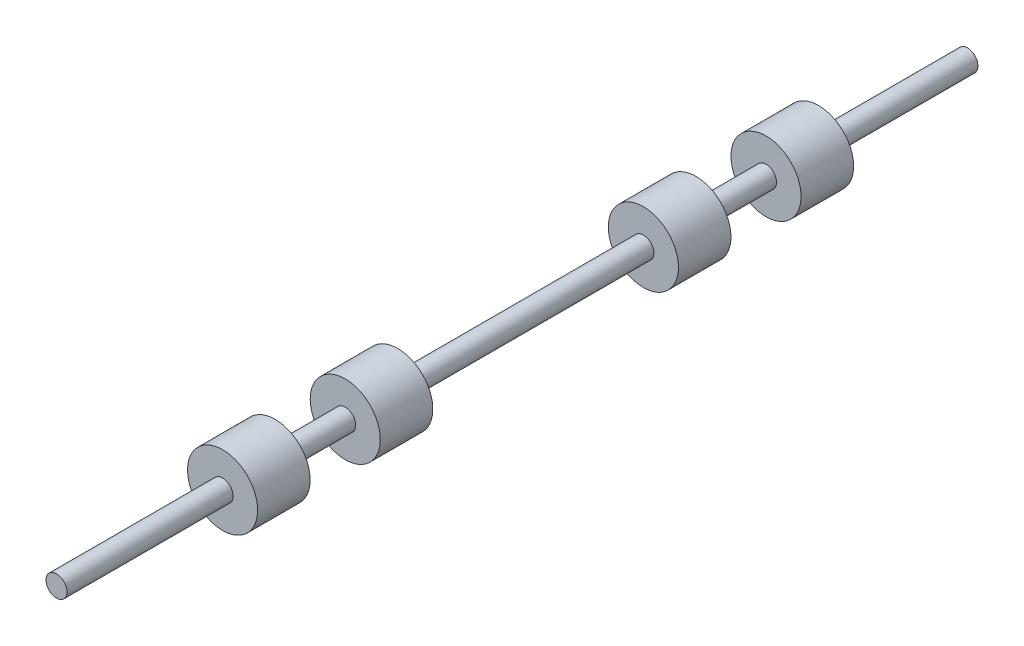
ISO-10303-21;
HEADER;
FILE_DESCRIPTION(('STEP AP214'),'2;1');
FILE_NAME('part.step','',(''),(''),'','','');
FILE_SCHEMA(('AUTOMOTIVE_DESIGN { 1 0 10303 214 1 1 1 1 }'));
ENDSEC;
DATA;
#1=APPLICATION_CONTEXT('core data for automotive mechanical design processes');
#2=APPLICATION_PROTOCOL_DEFINITION('international standard','automotive_design',2000,#1);
#3=PRODUCT_CONTEXT('',#1,'mechanical');
#4=PRODUCT('Part','Part','',(#3));
#5=PRODUCT_RELATED_PRODUCT_CATEGORY('part','',(#4));
#6=PRODUCT_DEFINITION_FORMATION('','',#4);
#7=PRODUCT_DEFINITION_CONTEXT('part definition',#1,'design');
#8=PRODUCT_DEFINITION('design','',#6,#7);
#9=PRODUCT_DEFINITION_SHAPE('','',#8);
#10=(LENGTH_UNIT() NAMED_UNIT(*) SI_UNIT(.MILLI.,.METRE.));
#11=(NAMED_UNIT(*) PLANE_ANGLE_UNIT() SI_UNIT($,.RADIAN.));
#12=(NAMED_UNIT(*) SI_UNIT($,.STERADIAN.) SOLID_ANGLE_UNIT());
#13=UNCERTAINTY_MEASURE_WITH_UNIT(LENGTH_MEASURE(1.E-05),#10,'distance_accuracy_value','');
#14=(GEOMETRIC_REPRESENTATION_CONTEXT(3) GLOBAL_UNCERTAINTY_ASSIGNED_CONTEXT((#13)) GLOBAL_UNIT_ASSIGNED_CONTEXT((#10,
#11,#12)) REPRESENTATION_CONTEXT('',''));
#15=CARTESIAN_POINT('',(0.,0.,0.));
#16=DIRECTION('',(0.,0.,1.));
#17=DIRECTION('',(1.,0.,0.));
#18=AXIS2_PLACEMENT_3D('',#15,#16,#17);
#19=CARTESIAN_POINT('',(0.,0.,660.4));
#20=DIRECTION('',(0.,0.,-1.));
#21=DIRECTION('',(-1.,0.,0.));
#22=AXIS2_PLACEMENT_3D('',#19,#20,#21);
#23=CYLINDRICAL_SURFACE('',#22,7.62);
#24=CARTESIAN_POINT('',(0.,0.,451.104));
#25=DIRECTION('',(0.,0.,-1.));
#26=DIRECTION('',(-1.,0.,0.));
#27=AXIS2_PLACEMENT_3D('',#24,#25,#26);
#28=CIRCLE('',#27,7.62);
#29=CARTESIAN_POINT('',(-7.62,0.,451.104));
#30=VERTEX_POINT('',#29);
#31=EDGE_CURVE('E59',#30,#30,#28,.T.);
#32=ORIENTED_EDGE('',*,*,#31,.F.);
#33=EDGE_LOOP('',(#32));
#34=FACE_BOUND('',#33,.T.);
#35=CARTESIAN_POINT('',(0.,0.,501.904));
#36=DIRECTION('',(0.,0.,1.));
#37=DIRECTION('',(1.,0.,0.));
#38=AXIS2_PLACEMENT_3D('',#35,#36,#37);
#39=CIRCLE('',#38,7.62);
#40=CARTESIAN_POINT('',(7.62,0.,501.904));
#41=VERTEX_POINT('',#40);
#42=EDGE_CURVE('E10',#41,#41,#39,.T.);
#43=ORIENTED_EDGE('',*,*,#42,.F.);
#44=EDGE_LOOP('',(#43));
#45=FACE_BOUND('',#44,.T.);
#46=ADVANCED_FACE('F41',(#34,#45),#23,.T.);
#47=CARTESIAN_POINT('',(0.,0.,234.95));
#48=DIRECTION('',(0.,0.,-1.));
#49=DIRECTION('',(-1.,0.,0.));
#50=AXIS2_PLACEMENT_3D('',#47,#48,#49);
#51=CIRCLE('',#50,7.62);
#52=CARTESIAN_POINT('',(-7.62,0.,234.95));
#53=VERTEX_POINT('',#52);
#54=EDGE_CURVE('E65',#53,#53,#51,.T.);
#55=ORIENTED_EDGE('',*,*,#54,.F.);
#56=EDGE_LOOP('',(#55));
#57=FACE_BOUND('',#56,.T.);
#58=CARTESIAN_POINT('',(0.,0.,413.004));
#59=DIRECTION('',(0.,0.,1.));
#60=DIRECTION('',(1.,0.,0.));
#61=AXIS2_PLACEMENT_3D('',#58,#59,#60);
#62=CIRCLE('',#61,7.62);
#63=CARTESIAN_POINT('',(7.62,0.,413.004));
#64=VERTEX_POINT('',#63);
#65=EDGE_CURVE('E54',#64,#64,#62,.T.);
#66=ORIENTED_EDGE('',*,*,#65,.F.);
#67=EDGE_LOOP('',(#66));
#68=FACE_BOUND('',#67,.T.);
#69=ADVANCED_FACE('F43',(#57,#68),#23,.T.);
#70=CARTESIAN_POINT('',(0.,0.,146.05));
#71=DIRECTION('',(0.,0.,-1.));
#72=DIRECTION('',(-1.,0.,0.));
#73=AXIS2_PLACEMENT_3D('',#70,#71,#72);
#74=CIRCLE('',#73,7.62);
#75=CARTESIAN_POINT('',(-7.62,0.,146.05));
#76=VERTEX_POINT('',#75);
#77=EDGE_CURVE('E73',#76,#76,#74,.T.);
#78=ORIENTED_EDGE('',*,*,#77,.F.);
#79=EDGE_LOOP('',(#78));
#80=FACE_BOUND('',#79,.T.);
#81=CARTESIAN_POINT('',(0.,0.,196.85));
#82=DIRECTION('',(0.,0.,1.));
#83=DIRECTION('',(1.,0.,0.));
#84=AXIS2_PLACEMENT_3D('',#81,#82,#83);
#85=CIRCLE('',#84,7.62);
#86=CARTESIAN_POINT('',(7.62,0.,196.85));
#87=VERTEX_POINT('',#86);
#88=EDGE_CURVE('E69',#87,#87,#85,.T.);
#89=ORIENTED_EDGE('',*,*,#88,.F.);
#90=EDGE_LOOP('',(#89));
#91=FACE_BOUND('',#90,.T.);
#92=ADVANCED_FACE('F143',(#80,#91),#23,.T.);
#93=CARTESIAN_POINT('',(0.,0.,146.05));
#94=DIRECTION('',(0.,0.,-1.));
#95=DIRECTION('',(-1.,0.,0.));
#96=AXIS2_PLACEMENT_3D('',#93,#94,#95);
#97=PLANE('',#96);
#98=ORIENTED_EDGE('',*,*,#77,.T.);
#99=EDGE_LOOP('',(#98));
#100=FACE_BOUND('',#99,.T.);
#101=CARTESIAN_POINT('',(0.,0.,146.05));
#102=DIRECTION('',(0.,0.,-1.));
#103=DIRECTION('',(-1.,0.,0.));
#104=AXIS2_PLACEMENT_3D('',#101,#102,#103);
#105=CIRCLE('',#104,25.4);
#106=CARTESIAN_POINT('',(-25.4,0.,146.05));
#107=VERTEX_POINT('',#106);
#108=EDGE_CURVE('E86',#107,#107,#105,.T.);
#109=ORIENTED_EDGE('',*,*,#108,.F.);
#110=EDGE_LOOP('',(#109));
#111=FACE_BOUND('',#110,.T.);
#112=ADVANCED_FACE('F155',(#100,#111),#97,.F.);
#113=CARTESIAN_POINT('',(0.,0.,0.));
#114=DIRECTION('',(0.,0.,-1.));
#115=DIRECTION('',(-1.,0.,0.));
#116=AXIS2_PLACEMENT_3D('',#113,#114,#115);
#117=CYLINDRICAL_SURFACE('',#116,25.4);
#118=CARTESIAN_POINT('',(0.,0.,107.95));
#119=DIRECTION('',(0.,0.,-1.));
#120=DIRECTION('',(-1.,0.,0.));
#121=AXIS2_PLACEMENT_3D('',#118,#119,#120);
#122=CIRCLE('',#121,25.4);
#123=CARTESIAN_POINT('',(-25.4,0.,107.95));
#124=VERTEX_POINT('',#123);
#125=EDGE_CURVE('E93',#124,#124,#122,.T.);
#126=ORIENTED_EDGE('',*,*,#125,.F.);
#127=EDGE_LOOP('',(#126));
#128=FACE_BOUND('',#127,.T.);
#129=ORIENTED_EDGE('',*,*,#108,.T.);
#130=EDGE_LOOP('',(#129));
#131=FACE_BOUND('',#130,.T.);
#132=ADVANCED_FACE('F160',(#128,#131),#117,.T.);
#133=CARTESIAN_POINT('',(0.,0.,107.95));
#134=DIRECTION('',(0.,0.,1.));
#135=DIRECTION('',(1.,0.,0.));
#136=AXIS2_PLACEMENT_3D('',#133,#134,#135);
#137=PLANE('',#136);
#138=CARTESIAN_POINT('',(0.,0.,107.95));
#139=DIRECTION('',(0.,0.,1.));
#140=DIRECTION('',(1.,0.,0.));
#141=AXIS2_PLACEMENT_3D('',#138,#139,#140);
#142=CIRCLE('',#141,7.62);
#143=CARTESIAN_POINT('',(7.62,0.,107.95));
#144=VERTEX_POINT('',#143);
#145=EDGE_CURVE('E77',#144,#144,#142,.T.);
#146=ORIENTED_EDGE('',*,*,#145,.T.);
#147=EDGE_LOOP('',(#146));
#148=FACE_BOUND('',#147,.T.);
#149=ORIENTED_EDGE('',*,*,#125,.T.);
#150=EDGE_LOOP('',(#149));
#151=FACE_BOUND('',#150,.T.);
#152=ADVANCED_FACE('F176',(#148,#151),#137,.F.);
#153=CARTESIAN_POINT('',(0.,0.,0.));
#154=DIRECTION('',(0.,0.,1.));
#155=DIRECTION('',(1.,0.,0.));
#156=AXIS2_PLACEMENT_3D('',#153,#154,#155);
#157=PLANE('',#156);
#158=CARTESIAN_POINT('',(0.,0.,0.));
#159=DIRECTION('',(0.,0.,1.));
#160=DIRECTION('',(1.,0.,0.));
#161=AXIS2_PLACEMENT_3D('',#158,#159,#160);
#162=CIRCLE('',#161,7.62);
#163=CARTESIAN_POINT('',(7.62,0.,0.));
#164=VERTEX_POINT('',#163);
#165=EDGE_CURVE('E82',#164,#164,#162,.T.);
#166=ORIENTED_EDGE('',*,*,#165,.F.);
#167=EDGE_LOOP('',(#166));
#168=FACE_BOUND('',#167,.T.);
#169=ADVANCED_FACE('F167',(#168),#157,.F.);
#170=ORIENTED_EDGE('',*,*,#165,.T.);
#171=EDGE_LOOP('',(#170));
#172=FACE_BOUND('',#171,.T.);
#173=ORIENTED_EDGE('',*,*,#145,.F.);
#174=EDGE_LOOP('',(#173));
#175=FACE_BOUND('',#174,.T.);
#176=ADVANCED_FACE('F145',(#172,#175),#23,.T.);
#177=CARTESIAN_POINT('',(0.,0.,234.95));
#178=DIRECTION('',(0.,0.,-1.));
#179=DIRECTION('',(-1.,0.,0.));
#180=AXIS2_PLACEMENT_3D('',#177,#178,#179);
#181=PLANE('',#180);
#182=ORIENTED_EDGE('',*,*,#54,.T.);
#183=EDGE_LOOP('',(#182));
#184=FACE_BOUND('',#183,.T.);
#185=CARTESIAN_POINT('',(0.,0.,234.95));
#186=DIRECTION('',(0.,0.,-1.));
#187=DIRECTION('',(-1.,0.,0.));
#188=AXIS2_PLACEMENT_3D('',#185,#186,#187);
#189=CIRCLE('',#188,25.4);
#190=CARTESIAN_POINT('',(-25.4,0.,234.95));
#191=VERTEX_POINT('',#190);
#192=EDGE_CURVE('E97',#191,#191,#189,.T.);
#193=ORIENTED_EDGE('',*,*,#192,.F.);
#194=EDGE_LOOP('',(#193));
#195=FACE_BOUND('',#194,.T.);
#196=ADVANCED_FACE('F166',(#184,#195),#181,.F.);
#197=CARTESIAN_POINT('',(0.,0.,0.));
#198=DIRECTION('',(0.,0.,-1.));
#199=DIRECTION('',(-1.,0.,0.));
#200=AXIS2_PLACEMENT_3D('',#197,#198,#199);
#201=CYLINDRICAL_SURFACE('',#200,25.4);
#202=CARTESIAN_POINT('',(0.,0.,196.85));
#203=DIRECTION('',(0.,0.,-1.));
#204=DIRECTION('',(-1.,0.,0.));
#205=AXIS2_PLACEMENT_3D('',#202,#203,#204);
#206=CIRCLE('',#205,25.4);
#207=CARTESIAN_POINT('',(-25.4,0.,196.85));
#208=VERTEX_POINT('',#207);
#209=EDGE_CURVE('E101',#208,#208,#206,.T.);
#210=ORIENTED_EDGE('',*,*,#209,.F.);
#211=EDGE_LOOP('',(#210));
#212=FACE_BOUND('',#211,.T.);
#213=ORIENTED_EDGE('',*,*,#192,.T.);
#214=EDGE_LOOP('',(#213));
#215=FACE_BOUND('',#214,.T.);
#216=ADVANCED_FACE('F173',(#212,#215),#201,.T.);
#217=CARTESIAN_POINT('',(0.,0.,196.85));
#218=DIRECTION('',(0.,0.,1.));
#219=DIRECTION('',(1.,0.,0.));
#220=AXIS2_PLACEMENT_3D('',#217,#218,#219);
#221=PLANE('',#220);
#222=ORIENTED_EDGE('',*,*,#88,.T.);
#223=EDGE_LOOP('',(#222));
#224=FACE_BOUND('',#223,.T.);
#225=ORIENTED_EDGE('',*,*,#209,.T.);
#226=EDGE_LOOP('',(#225));
#227=FACE_BOUND('',#226,.T.);
#228=ADVANCED_FACE('F197',(#224,#227),#221,.F.);
#229=CARTESIAN_POINT('',(0.,0.,413.004));
#230=DIRECTION('',(0.,0.,1.));
#231=DIRECTION('',(1.,0.,0.));
#232=AXIS2_PLACEMENT_3D('',#229,#230,#231);
#233=PLANE('',#232);
#234=ORIENTED_EDGE('',*,*,#65,.T.);
#235=EDGE_LOOP('',(#234));
#236=FACE_BOUND('',#235,.T.);
#237=CARTESIAN_POINT('',(0.,0.,413.004));
#238=DIRECTION('',(0.,0.,-1.));
#239=DIRECTION('',(-1.,0.,0.));
#240=AXIS2_PLACEMENT_3D('',#237,#238,#239);
#241=CIRCLE('',#240,25.4000000000001);
#242=CARTESIAN_POINT('',(-25.4000000000001,0.,413.004));
#243=VERTEX_POINT('',#242);
#244=EDGE_CURVE('E105',#243,#243,#241,.T.);
#245=ORIENTED_EDGE('',*,*,#244,.T.);
#246=EDGE_LOOP('',(#245));
#247=FACE_BOUND('',#246,.T.);
#248=ADVANCED_FACE('F201',(#236,#247),#233,.F.);
#249=CARTESIAN_POINT('',(0.,0.,0.));
#250=DIRECTION('',(0.,0.,-1.));
#251=DIRECTION('',(-1.,0.,0.));
#252=AXIS2_PLACEMENT_3D('',#249,#250,#251);
#253=CYLINDRICAL_SURFACE('',#252,25.4000000000001);
#254=ORIENTED_EDGE('',*,*,#244,.F.);
#255=EDGE_LOOP('',(#254));
#256=FACE_BOUND('',#255,.T.);
#257=CARTESIAN_POINT('',(0.,0.,451.104));
#258=DIRECTION('',(0.,0.,-1.));
#259=DIRECTION('',(-1.,0.,0.));
#260=AXIS2_PLACEMENT_3D('',#257,#258,#259);
#261=CIRCLE('',#260,25.4000000000001);
#262=CARTESIAN_POINT('',(-25.4000000000001,0.,451.104));
#263=VERTEX_POINT('',#262);
#264=EDGE_CURVE('E109',#263,#263,#261,.T.);
#265=ORIENTED_EDGE('',*,*,#264,.T.);
#266=EDGE_LOOP('',(#265));
#267=FACE_BOUND('',#266,.T.);
#268=ADVANCED_FACE('F205',(#256,#267),#253,.T.);
#269=CARTESIAN_POINT('',(0.,0.,451.104));
#270=DIRECTION('',(0.,0.,-1.));
#271=DIRECTION('',(-1.,0.,0.));
#272=AXIS2_PLACEMENT_3D('',#269,#270,#271);
#273=PLANE('',#272);
#274=ORIENTED_EDGE('',*,*,#31,.T.);
#275=EDGE_LOOP('',(#274));
#276=FACE_BOUND('',#275,.T.);
#277=ORIENTED_EDGE('',*,*,#264,.F.);
#278=EDGE_LOOP('',(#277));
#279=FACE_BOUND('',#278,.T.);
#280=ADVANCED_FACE('F209',(#276,#279),#273,.F.);
#281=CARTESIAN_POINT('',(0.,0.,501.904));
#282=DIRECTION('',(0.,0.,1.));
#283=DIRECTION('',(1.,0.,0.));
#284=AXIS2_PLACEMENT_3D('',#281,#282,#283);
#285=PLANE('',#284);
#286=ORIENTED_EDGE('',*,*,#42,.T.);
#287=EDGE_LOOP('',(#286));
#288=FACE_BOUND('',#287,.T.);
#289=CARTESIAN_POINT('',(0.,0.,501.904));
#290=DIRECTION('',(0.,0.,-1.));
#291=DIRECTION('',(-1.,0.,0.));
#292=AXIS2_PLACEMENT_3D('',#289,#290,#291);
#293=CIRCLE('',#292,25.4000000000001);
#294=CARTESIAN_POINT('',(-25.4000000000001,0.,501.904));
#295=VERTEX_POINT('',#294);
#296=EDGE_CURVE('E113',#295,#295,#293,.T.);
#297=ORIENTED_EDGE('',*,*,#296,.T.);
#298=EDGE_LOOP('',(#297));
#299=FACE_BOUND('',#298,.T.);
#300=ADVANCED_FACE('F135',(#288,#299),#285,.F.);
#301=CARTESIAN_POINT('',(0.,0.,0.));
#302=DIRECTION('',(0.,0.,-1.));
#303=DIRECTION('',(-1.,0.,0.));
#304=AXIS2_PLACEMENT_3D('',#301,#302,#303);
#305=CYLINDRICAL_SURFACE('',#304,25.4000000000001);
#306=ORIENTED_EDGE('',*,*,#296,.F.);
#307=EDGE_LOOP('',(#306));
#308=FACE_BOUND('',#307,.T.);
#309=CARTESIAN_POINT('',(0.,0.,540.004));
#310=DIRECTION('',(0.,0.,-1.));
#311=DIRECTION('',(-1.,0.,0.));
#312=AXIS2_PLACEMENT_3D('',#309,#310,#311);
#313=CIRCLE('',#312,25.4000000000001);
#314=CARTESIAN_POINT('',(-25.4000000000001,0.,540.004));
#315=VERTEX_POINT('',#314);
#316=EDGE_CURVE('E117',#315,#315,#313,.T.);
#317=ORIENTED_EDGE('',*,*,#316,.T.);
#318=EDGE_LOOP('',(#317));
#319=FACE_BOUND('',#318,.T.);
#320=ADVANCED_FACE('F122',(#308,#319),#305,.T.);
#321=CARTESIAN_POINT('',(0.,0.,540.004));
#322=DIRECTION('',(0.,0.,-1.));
#323=DIRECTION('',(-1.,0.,0.));
#324=AXIS2_PLACEMENT_3D('',#321,#322,#323);
#325=PLANE('',#324);
#326=CARTESIAN_POINT('',(0.,0.,540.004));
#327=DIRECTION('',(0.,0.,-1.));
#328=DIRECTION('',(-1.,0.,0.));
#329=AXIS2_PLACEMENT_3D('',#326,#327,#328);
#330=CIRCLE('',#329,7.62);
#331=CARTESIAN_POINT('',(-7.62,0.,540.004));
#332=VERTEX_POINT('',#331);
#333=EDGE_CURVE('E49',#332,#332,#330,.T.);
#334=ORIENTED_EDGE('',*,*,#333,.T.);
#335=EDGE_LOOP('',(#334));
#336=FACE_BOUND('',#335,.T.);
#337=ORIENTED_EDGE('',*,*,#316,.F.);
#338=EDGE_LOOP('',(#337));
#339=FACE_BOUND('',#338,.T.);
#340=ADVANCED_FACE('F124',(#336,#339),#325,.F.);
#341=CARTESIAN_POINT('',(0.,0.,660.4));
#342=DIRECTION('',(0.,0.,1.));
#343=DIRECTION('',(1.,0.,0.));
#344=AXIS2_PLACEMENT_3D('',#341,#342,#343);
#345=PLANE('',#344);
#346=CARTESIAN_POINT('',(0.,0.,660.4));
#347=DIRECTION('',(0.,0.,1.));
#348=DIRECTION('',(1.,0.,0.));
#349=AXIS2_PLACEMENT_3D('',#346,#347,#348);
#350=CIRCLE('',#349,7.62);
#351=CARTESIAN_POINT('',(7.62,0.,660.4));
#352=VERTEX_POINT('',#351);
#353=EDGE_CURVE('E81',#352,#352,#350,.T.);
#354=ORIENTED_EDGE('',*,*,#353,.T.);
#355=EDGE_LOOP('',(#354));
#356=FACE_BOUND('',#355,.T.);
#357=ADVANCED_FACE('F126',(#356),#345,.T.);
#358=ORIENTED_EDGE('',*,*,#353,.F.);
#359=EDGE_LOOP('',(#358));
#360=FACE_BOUND('',#359,.T.);
#361=ORIENTED_EDGE('',*,*,#333,.F.);
#362=EDGE_LOOP('',(#361));
#363=FACE_BOUND('',#362,.T.);
#364=ADVANCED_FACE('F132',(#360,#363),#23,.T.);
#365=CLOSED_SHELL('',(#46,#69,#92,#112,#132,#152,#169,#176,#196,#216,#228,#248,#268,#280,#300,
#320,#340,#357,#364));
#366=MANIFOLD_SOLID_BREP('B2',#365);
#367=ADVANCED_BREP_SHAPE_REPRESENTATION('',(#18,#366),#14);
#368=SHAPE_DEFINITION_REPRESENTATION(#9,#367);
ENDSEC;
END-ISO-10303-21;
